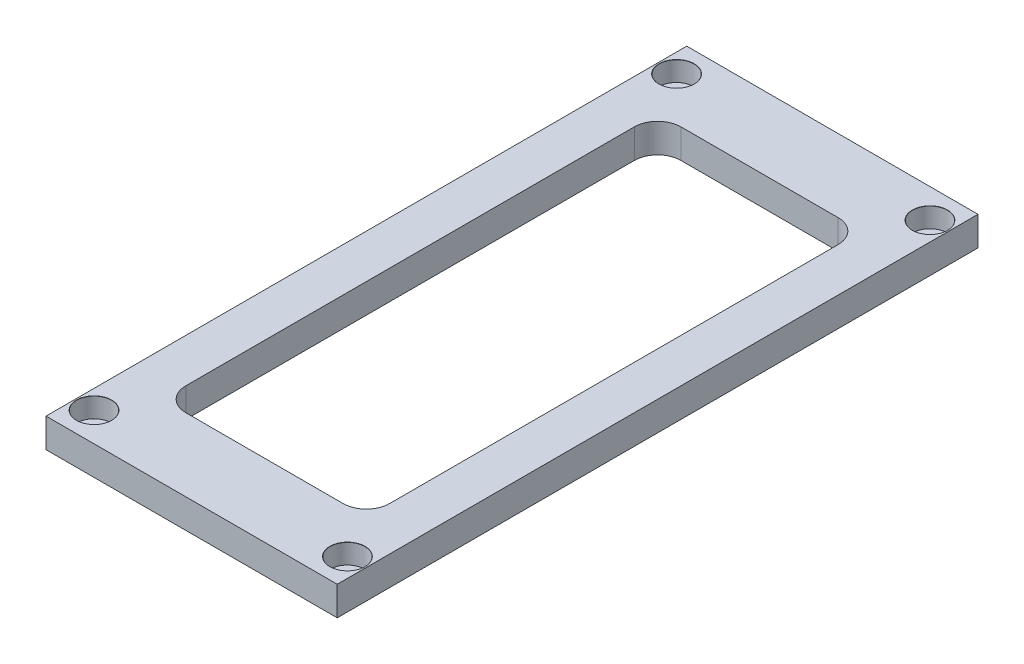
ISO-10303-21;
HEADER;
FILE_DESCRIPTION(('STEP AP214'),'2;1');
FILE_NAME('part.step','',(''),(''),'','','');
FILE_SCHEMA(('AUTOMOTIVE_DESIGN { 1 0 10303 214 1 1 1 1 }'));
ENDSEC;
DATA;
#1=APPLICATION_CONTEXT('core data for automotive mechanical design processes');
#2=APPLICATION_PROTOCOL_DEFINITION('international standard','automotive_design',2000,#1);
#3=PRODUCT_CONTEXT('',#1,'mechanical');
#4=PRODUCT('Part','Part','',(#3));
#5=PRODUCT_RELATED_PRODUCT_CATEGORY('part','',(#4));
#6=PRODUCT_DEFINITION_FORMATION('','',#4);
#7=PRODUCT_DEFINITION_CONTEXT('part definition',#1,'design');
#8=PRODUCT_DEFINITION('design','',#6,#7);
#9=PRODUCT_DEFINITION_SHAPE('','',#8);
#10=(LENGTH_UNIT() NAMED_UNIT(*) SI_UNIT(.MILLI.,.METRE.));
#11=(NAMED_UNIT(*) PLANE_ANGLE_UNIT() SI_UNIT($,.RADIAN.));
#12=(NAMED_UNIT(*) SI_UNIT($,.STERADIAN.) SOLID_ANGLE_UNIT());
#13=UNCERTAINTY_MEASURE_WITH_UNIT(LENGTH_MEASURE(1.E-05),#10,'distance_accuracy_value','');
#14=(GEOMETRIC_REPRESENTATION_CONTEXT(3) GLOBAL_UNCERTAINTY_ASSIGNED_CONTEXT((#13)) GLOBAL_UNIT_ASSIGNED_CONTEXT((#10,
#11,#12)) REPRESENTATION_CONTEXT('',''));
#15=CARTESIAN_POINT('',(0.,0.,0.));
#16=DIRECTION('',(0.,0.,1.));
#17=DIRECTION('',(1.,0.,0.));
#18=AXIS2_PLACEMENT_3D('',#15,#16,#17);
#19=CARTESIAN_POINT('',(-25.,5.,55.));
#20=DIRECTION('',(1.,0.,0.));
#21=DIRECTION('',(0.,0.,-1.));
#22=AXIS2_PLACEMENT_3D('',#19,#20,#21);
#23=PLANE('',#22);
#24=DIRECTION('',(0.,0.,1.));
#25=VECTOR('',#24,1.);
#26=CARTESIAN_POINT('',(-25.,0.,55.));
#27=LINE('',#26,#25);
#28=CARTESIAN_POINT('',(-25.,0.,-55.));
#29=VERTEX_POINT('',#28);
#30=CARTESIAN_POINT('',(-25.,0.,55.));
#31=VERTEX_POINT('',#30);
#32=EDGE_CURVE('E155',#29,#31,#27,.T.);
#33=ORIENTED_EDGE('',*,*,#32,.T.);
#34=DIRECTION('',(0.,-1.,0.));
#35=VECTOR('',#34,1.);
#36=CARTESIAN_POINT('',(-25.,5.,55.));
#37=LINE('',#36,#35);
#38=CARTESIAN_POINT('',(-25.,5.,55.));
#39=VERTEX_POINT('',#38);
#40=EDGE_CURVE('E134',#39,#31,#37,.T.);
#41=ORIENTED_EDGE('',*,*,#40,.F.);
#42=DIRECTION('',(0.,0.,1.));
#43=VECTOR('',#42,1.);
#44=CARTESIAN_POINT('',(-25.,5.,55.));
#45=LINE('',#44,#43);
#46=CARTESIAN_POINT('',(-25.,5.,-55.));
#47=VERTEX_POINT('',#46);
#48=EDGE_CURVE('E142',#47,#39,#45,.T.);
#49=ORIENTED_EDGE('',*,*,#48,.F.);
#50=DIRECTION('',(0.,-1.,0.));
#51=VECTOR('',#50,1.);
#52=CARTESIAN_POINT('',(-25.,5.,-55.));
#53=LINE('',#52,#51);
#54=EDGE_CURVE('E335',#47,#29,#53,.T.);
#55=ORIENTED_EDGE('',*,*,#54,.T.);
#56=EDGE_LOOP('',(#33,#41,#49,#55));
#57=FACE_BOUND('',#56,.T.);
#58=ADVANCED_FACE('F40',(#57),#23,.F.);
#59=CARTESIAN_POINT('',(25.,5.,55.));
#60=DIRECTION('',(0.,0.,-1.));
#61=DIRECTION('',(-1.,0.,0.));
#62=AXIS2_PLACEMENT_3D('',#59,#60,#61);
#63=PLANE('',#62);
#64=DIRECTION('',(1.,0.,0.));
#65=VECTOR('',#64,1.);
#66=CARTESIAN_POINT('',(25.,0.,55.));
#67=LINE('',#66,#65);
#68=CARTESIAN_POINT('',(25.,0.,55.));
#69=VERTEX_POINT('',#68);
#70=EDGE_CURVE('E338',#31,#69,#67,.T.);
#71=ORIENTED_EDGE('',*,*,#70,.T.);
#72=DIRECTION('',(0.,-1.,0.));
#73=VECTOR('',#72,1.);
#74=CARTESIAN_POINT('',(25.,5.,55.));
#75=LINE('',#74,#73);
#76=CARTESIAN_POINT('',(25.,5.,55.));
#77=VERTEX_POINT('',#76);
#78=EDGE_CURVE('E137',#77,#69,#75,.T.);
#79=ORIENTED_EDGE('',*,*,#78,.F.);
#80=DIRECTION('',(1.,0.,0.));
#81=VECTOR('',#80,1.);
#82=CARTESIAN_POINT('',(25.,5.,55.));
#83=LINE('',#82,#81);
#84=EDGE_CURVE('E130',#39,#77,#83,.T.);
#85=ORIENTED_EDGE('',*,*,#84,.F.);
#86=ORIENTED_EDGE('',*,*,#40,.T.);
#87=EDGE_LOOP('',(#71,#79,#85,#86));
#88=FACE_BOUND('',#87,.T.);
#89=ADVANCED_FACE('F132',(#88),#63,.F.);
#90=CARTESIAN_POINT('',(25.,5.,55.));
#91=DIRECTION('',(-1.,0.,0.));
#92=DIRECTION('',(0.,0.,1.));
#93=AXIS2_PLACEMENT_3D('',#90,#91,#92);
#94=PLANE('',#93);
#95=DIRECTION('',(0.,0.,-1.));
#96=VECTOR('',#95,1.);
#97=CARTESIAN_POINT('',(25.,0.,55.));
#98=LINE('',#97,#96);
#99=CARTESIAN_POINT('',(25.,0.,-55.));
#100=VERTEX_POINT('',#99);
#101=EDGE_CURVE('E341',#69,#100,#98,.T.);
#102=ORIENTED_EDGE('',*,*,#101,.T.);
#103=DIRECTION('',(0.,-1.,0.));
#104=VECTOR('',#103,1.);
#105=CARTESIAN_POINT('',(25.,5.,-55.));
#106=LINE('',#105,#104);
#107=CARTESIAN_POINT('',(25.,5.,-55.));
#108=VERTEX_POINT('',#107);
#109=EDGE_CURVE('E163',#108,#100,#106,.T.);
#110=ORIENTED_EDGE('',*,*,#109,.F.);
#111=DIRECTION('',(0.,0.,-1.));
#112=VECTOR('',#111,1.);
#113=CARTESIAN_POINT('',(25.,5.,55.));
#114=LINE('',#113,#112);
#115=EDGE_CURVE('E141',#77,#108,#114,.T.);
#116=ORIENTED_EDGE('',*,*,#115,.F.);
#117=ORIENTED_EDGE('',*,*,#78,.T.);
#118=EDGE_LOOP('',(#102,#110,#116,#117));
#119=FACE_BOUND('',#118,.T.);
#120=ADVANCED_FACE('F357',(#119),#94,.F.);
#121=CARTESIAN_POINT('',(25.,5.,-55.));
#122=DIRECTION('',(0.,0.,1.));
#123=DIRECTION('',(1.,0.,0.));
#124=AXIS2_PLACEMENT_3D('',#121,#122,#123);
#125=PLANE('',#124);
#126=DIRECTION('',(-1.,0.,0.));
#127=VECTOR('',#126,1.);
#128=CARTESIAN_POINT('',(25.,0.,-55.));
#129=LINE('',#128,#127);
#130=EDGE_CURVE('E152',#100,#29,#129,.T.);
#131=ORIENTED_EDGE('',*,*,#130,.T.);
#132=ORIENTED_EDGE('',*,*,#54,.F.);
#133=DIRECTION('',(-1.,0.,0.));
#134=VECTOR('',#133,1.);
#135=CARTESIAN_POINT('',(25.,5.,-55.));
#136=LINE('',#135,#134);
#137=EDGE_CURVE('E147',#108,#47,#136,.T.);
#138=ORIENTED_EDGE('',*,*,#137,.F.);
#139=ORIENTED_EDGE('',*,*,#109,.T.);
#140=EDGE_LOOP('',(#131,#132,#138,#139));
#141=FACE_BOUND('',#140,.T.);
#142=ADVANCED_FACE('F352',(#141),#125,.F.);
#143=CARTESIAN_POINT('',(0.,5.,0.));
#144=DIRECTION('',(0.,1.,0.));
#145=DIRECTION('',(0.,0.,1.));
#146=AXIS2_PLACEMENT_3D('',#143,#144,#145);
#147=PLANE('',#146);
#148=DIRECTION('',(0.,0.,1.));
#149=VECTOR('',#148,1.);
#150=CARTESIAN_POINT('',(-17.5,5.,42.5));
#151=LINE('',#150,#149);
#152=CARTESIAN_POINT('',(-17.5,5.,-38.5));
#153=VERTEX_POINT('',#152);
#154=CARTESIAN_POINT('',(-17.5,5.,38.5));
#155=VERTEX_POINT('',#154);
#156=EDGE_CURVE('E237',#153,#155,#151,.T.);
#157=ORIENTED_EDGE('',*,*,#156,.F.);
#158=CARTESIAN_POINT('',(-13.5,5.,-38.5));
#159=DIRECTION('',(0.,1.,0.));
#160=DIRECTION('',(0.,0.,1.));
#161=AXIS2_PLACEMENT_3D('',#158,#159,#160);
#162=CIRCLE('',#161,4.);
#163=CARTESIAN_POINT('',(-13.5,5.,-42.5));
#164=VERTEX_POINT('',#163);
#165=EDGE_CURVE('E49',#153,#164,#162,.F.);
#166=ORIENTED_EDGE('',*,*,#165,.T.);
#167=DIRECTION('',(-1.,0.,0.));
#168=VECTOR('',#167,1.);
#169=CARTESIAN_POINT('',(17.5,5.,-42.5));
#170=LINE('',#169,#168);
#171=CARTESIAN_POINT('',(13.5,5.,-42.5));
#172=VERTEX_POINT('',#171);
#173=EDGE_CURVE('E236',#172,#164,#170,.T.);
#174=ORIENTED_EDGE('',*,*,#173,.F.);
#175=CARTESIAN_POINT('',(13.5,5.,-38.5));
#176=DIRECTION('',(0.,1.,0.));
#177=DIRECTION('',(0.,0.,1.));
#178=AXIS2_PLACEMENT_3D('',#175,#176,#177);
#179=CIRCLE('',#178,4.);
#180=CARTESIAN_POINT('',(17.5,5.,-38.5));
#181=VERTEX_POINT('',#180);
#182=EDGE_CURVE('E213',#172,#181,#179,.F.);
#183=ORIENTED_EDGE('',*,*,#182,.T.);
#184=DIRECTION('',(0.,0.,-1.));
#185=VECTOR('',#184,1.);
#186=CARTESIAN_POINT('',(17.5,5.,42.5));
#187=LINE('',#186,#185);
#188=CARTESIAN_POINT('',(17.5,5.,38.5));
#189=VERTEX_POINT('',#188);
#190=EDGE_CURVE('E247',#189,#181,#187,.T.);
#191=ORIENTED_EDGE('',*,*,#190,.F.);
#192=CARTESIAN_POINT('',(13.5,5.,38.5));
#193=DIRECTION('',(0.,1.,0.));
#194=DIRECTION('',(0.,0.,1.));
#195=AXIS2_PLACEMENT_3D('',#192,#193,#194);
#196=CIRCLE('',#195,4.);
#197=CARTESIAN_POINT('',(13.5,5.,42.5));
#198=VERTEX_POINT('',#197);
#199=EDGE_CURVE('E219',#189,#198,#196,.F.);
#200=ORIENTED_EDGE('',*,*,#199,.T.);
#201=DIRECTION('',(1.,0.,0.));
#202=VECTOR('',#201,1.);
#203=CARTESIAN_POINT('',(17.5,5.,42.5));
#204=LINE('',#203,#202);
#205=CARTESIAN_POINT('',(-13.5,5.,42.5));
#206=VERTEX_POINT('',#205);
#207=EDGE_CURVE('E268',#206,#198,#204,.T.);
#208=ORIENTED_EDGE('',*,*,#207,.F.);
#209=CARTESIAN_POINT('',(-13.5,5.,38.5));
#210=DIRECTION('',(0.,1.,0.));
#211=DIRECTION('',(0.,0.,1.));
#212=AXIS2_PLACEMENT_3D('',#209,#210,#211);
#213=CIRCLE('',#212,4.);
#214=EDGE_CURVE('E225',#206,#155,#213,.F.);
#215=ORIENTED_EDGE('',*,*,#214,.T.);
#216=EDGE_LOOP('',(#157,#166,#174,#183,#191,#200,#208,#215));
#217=FACE_BOUND('',#216,.T.);
#218=CARTESIAN_POINT('',(-21.75,5.,-50.));
#219=DIRECTION('',(0.,1.,0.));
#220=DIRECTION('',(0.,0.,1.));
#221=AXIS2_PLACEMENT_3D('',#218,#219,#220);
#222=CIRCLE('',#221,3.025);
#223=CARTESIAN_POINT('',(-21.75,5.,-46.975));
#224=VERTEX_POINT('',#223);
#225=EDGE_CURVE('E265',#224,#224,#222,.T.);
#226=ORIENTED_EDGE('',*,*,#225,.F.);
#227=EDGE_LOOP('',(#226));
#228=FACE_BOUND('',#227,.T.);
#229=CARTESIAN_POINT('',(21.75,5.,-50.));
#230=DIRECTION('',(0.,1.,0.));
#231=DIRECTION('',(0.,0.,1.));
#232=AXIS2_PLACEMENT_3D('',#229,#230,#231);
#233=CIRCLE('',#232,3.025);
#234=CARTESIAN_POINT('',(21.75,5.,-46.975));
#235=VERTEX_POINT('',#234);
#236=EDGE_CURVE('E187',#235,#235,#233,.T.);
#237=ORIENTED_EDGE('',*,*,#236,.F.);
#238=EDGE_LOOP('',(#237));
#239=FACE_BOUND('',#238,.T.);
#240=CARTESIAN_POINT('',(-21.75,5.,50.));
#241=DIRECTION('',(0.,1.,0.));
#242=DIRECTION('',(0.,0.,1.));
#243=AXIS2_PLACEMENT_3D('',#240,#241,#242);
#244=CIRCLE('',#243,3.025);
#245=CARTESIAN_POINT('',(-21.75,5.,53.025));
#246=VERTEX_POINT('',#245);
#247=EDGE_CURVE('E182',#246,#246,#244,.T.);
#248=ORIENTED_EDGE('',*,*,#247,.F.);
#249=EDGE_LOOP('',(#248));
#250=FACE_BOUND('',#249,.T.);
#251=CARTESIAN_POINT('',(21.75,5.,50.));
#252=DIRECTION('',(0.,1.,0.));
#253=DIRECTION('',(0.,0.,1.));
#254=AXIS2_PLACEMENT_3D('',#251,#252,#253);
#255=CIRCLE('',#254,3.025);
#256=CARTESIAN_POINT('',(21.75,5.,53.025));
#257=VERTEX_POINT('',#256);
#258=EDGE_CURVE('E176',#257,#257,#255,.T.);
#259=ORIENTED_EDGE('',*,*,#258,.F.);
#260=EDGE_LOOP('',(#259));
#261=FACE_BOUND('',#260,.T.);
#262=ORIENTED_EDGE('',*,*,#48,.T.);
#263=ORIENTED_EDGE('',*,*,#84,.T.);
#264=ORIENTED_EDGE('',*,*,#115,.T.);
#265=ORIENTED_EDGE('',*,*,#137,.T.);
#266=EDGE_LOOP('',(#262,#263,#264,#265));
#267=FACE_BOUND('',#266,.T.);
#268=ADVANCED_FACE('F145',(#217,#228,#239,#250,#261,#267),#147,.T.);
#269=CARTESIAN_POINT('',(0.,0.,0.));
#270=DIRECTION('',(0.,1.,0.));
#271=DIRECTION('',(0.,0.,1.));
#272=AXIS2_PLACEMENT_3D('',#269,#270,#271);
#273=PLANE('',#272);
#274=DIRECTION('',(0.,0.,-1.));
#275=VECTOR('',#274,1.);
#276=CARTESIAN_POINT('',(17.5,0.,42.5));
#277=LINE('',#276,#275);
#278=CARTESIAN_POINT('',(17.5,0.,38.5));
#279=VERTEX_POINT('',#278);
#280=CARTESIAN_POINT('',(17.5,0.,-38.5));
#281=VERTEX_POINT('',#280);
#282=EDGE_CURVE('E256',#279,#281,#277,.T.);
#283=ORIENTED_EDGE('',*,*,#282,.T.);
#284=CARTESIAN_POINT('',(13.5,0.,-38.5));
#285=DIRECTION('',(0.,1.,0.));
#286=DIRECTION('',(0.,0.,1.));
#287=AXIS2_PLACEMENT_3D('',#284,#285,#286);
#288=CIRCLE('',#287,4.);
#289=CARTESIAN_POINT('',(13.5,0.,-42.5));
#290=VERTEX_POINT('',#289);
#291=EDGE_CURVE('E216',#281,#290,#288,.T.);
#292=ORIENTED_EDGE('',*,*,#291,.T.);
#293=DIRECTION('',(-1.,0.,0.));
#294=VECTOR('',#293,1.);
#295=CARTESIAN_POINT('',(17.5,0.,-42.5));
#296=LINE('',#295,#294);
#297=CARTESIAN_POINT('',(-13.5,0.,-42.5));
#298=VERTEX_POINT('',#297);
#299=EDGE_CURVE('E262',#290,#298,#296,.T.);
#300=ORIENTED_EDGE('',*,*,#299,.T.);
#301=CARTESIAN_POINT('',(-13.5,0.,-38.5));
#302=DIRECTION('',(0.,1.,0.));
#303=DIRECTION('',(0.,0.,1.));
#304=AXIS2_PLACEMENT_3D('',#301,#302,#303);
#305=CIRCLE('',#304,4.);
#306=CARTESIAN_POINT('',(-17.5,0.,-38.5));
#307=VERTEX_POINT('',#306);
#308=EDGE_CURVE('E11',#298,#307,#305,.T.);
#309=ORIENTED_EDGE('',*,*,#308,.T.);
#310=DIRECTION('',(0.,0.,1.));
#311=VECTOR('',#310,1.);
#312=CARTESIAN_POINT('',(-17.5,0.,42.5));
#313=LINE('',#312,#311);
#314=CARTESIAN_POINT('',(-17.5,0.,38.5));
#315=VERTEX_POINT('',#314);
#316=EDGE_CURVE('E246',#307,#315,#313,.T.);
#317=ORIENTED_EDGE('',*,*,#316,.T.);
#318=CARTESIAN_POINT('',(-13.5,0.,38.5));
#319=DIRECTION('',(0.,1.,0.));
#320=DIRECTION('',(0.,0.,1.));
#321=AXIS2_PLACEMENT_3D('',#318,#319,#320);
#322=CIRCLE('',#321,4.);
#323=CARTESIAN_POINT('',(-13.5,0.,42.5));
#324=VERTEX_POINT('',#323);
#325=EDGE_CURVE('E228',#315,#324,#322,.T.);
#326=ORIENTED_EDGE('',*,*,#325,.T.);
#327=DIRECTION('',(1.,0.,0.));
#328=VECTOR('',#327,1.);
#329=CARTESIAN_POINT('',(17.5,0.,42.5));
#330=LINE('',#329,#328);
#331=CARTESIAN_POINT('',(13.5,0.,42.5));
#332=VERTEX_POINT('',#331);
#333=EDGE_CURVE('E252',#324,#332,#330,.T.);
#334=ORIENTED_EDGE('',*,*,#333,.T.);
#335=CARTESIAN_POINT('',(13.5,0.,38.5));
#336=DIRECTION('',(0.,1.,0.));
#337=DIRECTION('',(0.,0.,1.));
#338=AXIS2_PLACEMENT_3D('',#335,#336,#337);
#339=CIRCLE('',#338,4.);
#340=EDGE_CURVE('E222',#332,#279,#339,.T.);
#341=ORIENTED_EDGE('',*,*,#340,.T.);
#342=EDGE_LOOP('',(#283,#292,#300,#309,#317,#326,#334,#341));
#343=FACE_BOUND('',#342,.T.);
#344=CARTESIAN_POINT('',(-21.75,0.,-50.));
#345=DIRECTION('',(0.,1.,0.));
#346=DIRECTION('',(0.,0.,1.));
#347=AXIS2_PLACEMENT_3D('',#344,#345,#346);
#348=CIRCLE('',#347,1.6);
#349=CARTESIAN_POINT('',(-21.75,0.,-48.4));
#350=VERTEX_POINT('',#349);
#351=EDGE_CURVE('E184',#350,#350,#348,.T.);
#352=ORIENTED_EDGE('',*,*,#351,.T.);
#353=EDGE_LOOP('',(#352));
#354=FACE_BOUND('',#353,.T.);
#355=CARTESIAN_POINT('',(21.75,0.,-50.));
#356=DIRECTION('',(0.,1.,0.));
#357=DIRECTION('',(0.,0.,1.));
#358=AXIS2_PLACEMENT_3D('',#355,#356,#357);
#359=CIRCLE('',#358,1.6);
#360=CARTESIAN_POINT('',(21.75,0.,-48.4));
#361=VERTEX_POINT('',#360);
#362=EDGE_CURVE('E178',#361,#361,#359,.T.);
#363=ORIENTED_EDGE('',*,*,#362,.T.);
#364=EDGE_LOOP('',(#363));
#365=FACE_BOUND('',#364,.T.);
#366=CARTESIAN_POINT('',(-21.75,0.,50.));
#367=DIRECTION('',(0.,1.,0.));
#368=DIRECTION('',(0.,0.,1.));
#369=AXIS2_PLACEMENT_3D('',#366,#367,#368);
#370=CIRCLE('',#369,1.6);
#371=CARTESIAN_POINT('',(-21.75,0.,51.6));
#372=VERTEX_POINT('',#371);
#373=EDGE_CURVE('E172',#372,#372,#370,.T.);
#374=ORIENTED_EDGE('',*,*,#373,.T.);
#375=EDGE_LOOP('',(#374));
#376=FACE_BOUND('',#375,.T.);
#377=CARTESIAN_POINT('',(21.75,0.,50.));
#378=DIRECTION('',(0.,1.,0.));
#379=DIRECTION('',(0.,0.,1.));
#380=AXIS2_PLACEMENT_3D('',#377,#378,#379);
#381=CIRCLE('',#380,1.6);
#382=CARTESIAN_POINT('',(21.75,0.,51.6));
#383=VERTEX_POINT('',#382);
#384=EDGE_CURVE('E167',#383,#383,#381,.T.);
#385=ORIENTED_EDGE('',*,*,#384,.T.);
#386=EDGE_LOOP('',(#385));
#387=FACE_BOUND('',#386,.T.);
#388=ORIENTED_EDGE('',*,*,#32,.F.);
#389=ORIENTED_EDGE('',*,*,#130,.F.);
#390=ORIENTED_EDGE('',*,*,#101,.F.);
#391=ORIENTED_EDGE('',*,*,#70,.F.);
#392=EDGE_LOOP('',(#388,#389,#390,#391));
#393=FACE_BOUND('',#392,.T.);
#394=ADVANCED_FACE('F356',(#343,#354,#365,#376,#387,#393),#273,.F.);
#395=CARTESIAN_POINT('',(21.75,5.,50.));
#396=DIRECTION('',(0.,1.,0.));
#397=DIRECTION('',(0.,0.,1.));
#398=AXIS2_PLACEMENT_3D('',#395,#396,#397);
#399=CYLINDRICAL_SURFACE('',#398,1.6);
#400=CARTESIAN_POINT('',(21.75,1.6,50.));
#401=DIRECTION('',(0.,1.,0.));
#402=DIRECTION('',(0.,0.,1.));
#403=AXIS2_PLACEMENT_3D('',#400,#401,#402);
#404=CIRCLE('',#403,1.6);
#405=CARTESIAN_POINT('',(21.75,1.6,51.6));
#406=VERTEX_POINT('',#405);
#407=EDGE_CURVE('E171',#406,#406,#404,.T.);
#408=ORIENTED_EDGE('',*,*,#407,.T.);
#409=EDGE_LOOP('',(#408));
#410=FACE_BOUND('',#409,.T.);
#411=ORIENTED_EDGE('',*,*,#384,.F.);
#412=EDGE_LOOP('',(#411));
#413=FACE_BOUND('',#412,.T.);
#414=ADVANCED_FACE('F469',(#410,#413),#399,.F.);
#415=CARTESIAN_POINT('',(23.35,1.6,50.));
#416=DIRECTION('',(0.,-1.,0.));
#417=DIRECTION('',(0.,0.,-1.));
#418=AXIS2_PLACEMENT_3D('',#415,#416,#417);
#419=PLANE('',#418);
#420=ORIENTED_EDGE('',*,*,#407,.F.);
#421=EDGE_LOOP('',(#420));
#422=FACE_BOUND('',#421,.T.);
#423=CARTESIAN_POINT('',(21.75,1.6,50.));
#424=DIRECTION('',(0.,1.,0.));
#425=DIRECTION('',(0.,0.,1.));
#426=AXIS2_PLACEMENT_3D('',#423,#424,#425);
#427=CIRCLE('',#426,3.);
#428=CARTESIAN_POINT('',(21.75,1.6,53.));
#429=VERTEX_POINT('',#428);
#430=EDGE_CURVE('E324',#429,#429,#427,.T.);
#431=ORIENTED_EDGE('',*,*,#430,.T.);
#432=EDGE_LOOP('',(#431));
#433=FACE_BOUND('',#432,.T.);
#434=ADVANCED_FACE('F465',(#422,#433),#419,.F.);
#435=CARTESIAN_POINT('',(21.75,5.,50.));
#436=DIRECTION('',(0.,1.,0.));
#437=DIRECTION('',(0.,0.,1.));
#438=AXIS2_PLACEMENT_3D('',#435,#436,#437);
#439=CYLINDRICAL_SURFACE('',#438,3.);
#440=ORIENTED_EDGE('',*,*,#430,.F.);
#441=EDGE_LOOP('',(#440));
#442=FACE_BOUND('',#441,.T.);
#443=CARTESIAN_POINT('',(21.75,4.975,50.));
#444=DIRECTION('',(0.,1.,0.));
#445=DIRECTION('',(0.,0.,1.));
#446=AXIS2_PLACEMENT_3D('',#443,#444,#445);
#447=CIRCLE('',#446,3.);
#448=CARTESIAN_POINT('',(21.75,4.975,53.));
#449=VERTEX_POINT('',#448);
#450=EDGE_CURVE('E320',#449,#449,#447,.T.);
#451=ORIENTED_EDGE('',*,*,#450,.T.);
#452=EDGE_LOOP('',(#451));
#453=FACE_BOUND('',#452,.T.);
#454=ADVANCED_FACE('F461',(#442,#453),#439,.F.);
#455=CARTESIAN_POINT('',(21.75,5.,50.));
#456=DIRECTION('',(0.,1.,0.));
#457=DIRECTION('',(0.,0.,1.));
#458=AXIS2_PLACEMENT_3D('',#455,#456,#457);
#459=CONICAL_SURFACE('',#458,3.025,0.785398163397448);
#460=ORIENTED_EDGE('',*,*,#450,.F.);
#461=EDGE_LOOP('',(#460));
#462=FACE_BOUND('',#461,.T.);
#463=ORIENTED_EDGE('',*,*,#258,.T.);
#464=EDGE_LOOP('',(#463));
#465=FACE_BOUND('',#464,.T.);
#466=ADVANCED_FACE('F457',(#462,#465),#459,.F.);
#467=CARTESIAN_POINT('',(-21.75,5.,50.));
#468=DIRECTION('',(0.,1.,0.));
#469=DIRECTION('',(0.,0.,1.));
#470=AXIS2_PLACEMENT_3D('',#467,#468,#469);
#471=CYLINDRICAL_SURFACE('',#470,1.6);
#472=CARTESIAN_POINT('',(-21.75,1.6,50.));
#473=DIRECTION('',(0.,1.,0.));
#474=DIRECTION('',(0.,0.,1.));
#475=AXIS2_PLACEMENT_3D('',#472,#473,#474);
#476=CIRCLE('',#475,1.6);
#477=CARTESIAN_POINT('',(-21.75,1.6,51.6));
#478=VERTEX_POINT('',#477);
#479=EDGE_CURVE('E177',#478,#478,#476,.T.);
#480=ORIENTED_EDGE('',*,*,#479,.T.);
#481=EDGE_LOOP('',(#480));
#482=FACE_BOUND('',#481,.T.);
#483=ORIENTED_EDGE('',*,*,#373,.F.);
#484=EDGE_LOOP('',(#483));
#485=FACE_BOUND('',#484,.T.);
#486=ADVANCED_FACE('F453',(#482,#485),#471,.F.);
#487=CARTESIAN_POINT('',(-20.15,1.6,50.));
#488=DIRECTION('',(0.,-1.,0.));
#489=DIRECTION('',(0.,0.,-1.));
#490=AXIS2_PLACEMENT_3D('',#487,#488,#489);
#491=PLANE('',#490);
#492=ORIENTED_EDGE('',*,*,#479,.F.);
#493=EDGE_LOOP('',(#492));
#494=FACE_BOUND('',#493,.T.);
#495=CARTESIAN_POINT('',(-21.75,1.6,50.));
#496=DIRECTION('',(0.,1.,0.));
#497=DIRECTION('',(0.,0.,1.));
#498=AXIS2_PLACEMENT_3D('',#495,#496,#497);
#499=CIRCLE('',#498,3.);
#500=CARTESIAN_POINT('',(-21.75,1.6,53.));
#501=VERTEX_POINT('',#500);
#502=EDGE_CURVE('E310',#501,#501,#499,.T.);
#503=ORIENTED_EDGE('',*,*,#502,.T.);
#504=EDGE_LOOP('',(#503));
#505=FACE_BOUND('',#504,.T.);
#506=ADVANCED_FACE('F449',(#494,#505),#491,.F.);
#507=CARTESIAN_POINT('',(-21.75,5.,50.));
#508=DIRECTION('',(0.,1.,0.));
#509=DIRECTION('',(0.,0.,1.));
#510=AXIS2_PLACEMENT_3D('',#507,#508,#509);
#511=CYLINDRICAL_SURFACE('',#510,3.);
#512=ORIENTED_EDGE('',*,*,#502,.F.);
#513=EDGE_LOOP('',(#512));
#514=FACE_BOUND('',#513,.T.);
#515=CARTESIAN_POINT('',(-21.75,4.975,50.));
#516=DIRECTION('',(0.,1.,0.));
#517=DIRECTION('',(0.,0.,1.));
#518=AXIS2_PLACEMENT_3D('',#515,#516,#517);
#519=CIRCLE('',#518,3.);
#520=CARTESIAN_POINT('',(-21.75,4.975,53.));
#521=VERTEX_POINT('',#520);
#522=EDGE_CURVE('E306',#521,#521,#519,.T.);
#523=ORIENTED_EDGE('',*,*,#522,.T.);
#524=EDGE_LOOP('',(#523));
#525=FACE_BOUND('',#524,.T.);
#526=ADVANCED_FACE('F445',(#514,#525),#511,.F.);
#527=CARTESIAN_POINT('',(-21.75,5.,50.));
#528=DIRECTION('',(0.,1.,0.));
#529=DIRECTION('',(0.,0.,1.));
#530=AXIS2_PLACEMENT_3D('',#527,#528,#529);
#531=CONICAL_SURFACE('',#530,3.025,0.785398163397448);
#532=ORIENTED_EDGE('',*,*,#522,.F.);
#533=EDGE_LOOP('',(#532));
#534=FACE_BOUND('',#533,.T.);
#535=ORIENTED_EDGE('',*,*,#247,.T.);
#536=EDGE_LOOP('',(#535));
#537=FACE_BOUND('',#536,.T.);
#538=ADVANCED_FACE('F441',(#534,#537),#531,.F.);
#539=CARTESIAN_POINT('',(21.75,5.,-50.));
#540=DIRECTION('',(0.,1.,0.));
#541=DIRECTION('',(0.,0.,1.));
#542=AXIS2_PLACEMENT_3D('',#539,#540,#541);
#543=CYLINDRICAL_SURFACE('',#542,1.6);
#544=CARTESIAN_POINT('',(21.75,1.6,-50.));
#545=DIRECTION('',(0.,1.,0.));
#546=DIRECTION('',(0.,0.,1.));
#547=AXIS2_PLACEMENT_3D('',#544,#545,#546);
#548=CIRCLE('',#547,1.6);
#549=CARTESIAN_POINT('',(21.75,1.6,-48.4));
#550=VERTEX_POINT('',#549);
#551=EDGE_CURVE('E183',#550,#550,#548,.T.);
#552=ORIENTED_EDGE('',*,*,#551,.T.);
#553=EDGE_LOOP('',(#552));
#554=FACE_BOUND('',#553,.T.);
#555=ORIENTED_EDGE('',*,*,#362,.F.);
#556=EDGE_LOOP('',(#555));
#557=FACE_BOUND('',#556,.T.);
#558=ADVANCED_FACE('F437',(#554,#557),#543,.F.);
#559=CARTESIAN_POINT('',(23.35,1.6,-50.));
#560=DIRECTION('',(0.,-1.,0.));
#561=DIRECTION('',(0.,0.,-1.));
#562=AXIS2_PLACEMENT_3D('',#559,#560,#561);
#563=PLANE('',#562);
#564=ORIENTED_EDGE('',*,*,#551,.F.);
#565=EDGE_LOOP('',(#564));
#566=FACE_BOUND('',#565,.T.);
#567=CARTESIAN_POINT('',(21.75,1.6,-50.));
#568=DIRECTION('',(0.,1.,0.));
#569=DIRECTION('',(0.,0.,1.));
#570=AXIS2_PLACEMENT_3D('',#567,#568,#569);
#571=CIRCLE('',#570,3.);
#572=CARTESIAN_POINT('',(21.75,1.6,-47.));
#573=VERTEX_POINT('',#572);
#574=EDGE_CURVE('E296',#573,#573,#571,.T.);
#575=ORIENTED_EDGE('',*,*,#574,.T.);
#576=EDGE_LOOP('',(#575));
#577=FACE_BOUND('',#576,.T.);
#578=ADVANCED_FACE('F433',(#566,#577),#563,.F.);
#579=CARTESIAN_POINT('',(21.75,5.,-50.));
#580=DIRECTION('',(0.,1.,0.));
#581=DIRECTION('',(0.,0.,1.));
#582=AXIS2_PLACEMENT_3D('',#579,#580,#581);
#583=CYLINDRICAL_SURFACE('',#582,3.);
#584=ORIENTED_EDGE('',*,*,#574,.F.);
#585=EDGE_LOOP('',(#584));
#586=FACE_BOUND('',#585,.T.);
#587=CARTESIAN_POINT('',(21.75,4.975,-50.));
#588=DIRECTION('',(0.,1.,0.));
#589=DIRECTION('',(0.,0.,1.));
#590=AXIS2_PLACEMENT_3D('',#587,#588,#589);
#591=CIRCLE('',#590,3.);
#592=CARTESIAN_POINT('',(21.75,4.975,-47.));
#593=VERTEX_POINT('',#592);
#594=EDGE_CURVE('E292',#593,#593,#591,.T.);
#595=ORIENTED_EDGE('',*,*,#594,.T.);
#596=EDGE_LOOP('',(#595));
#597=FACE_BOUND('',#596,.T.);
#598=ADVANCED_FACE('F429',(#586,#597),#583,.F.);
#599=CARTESIAN_POINT('',(21.75,5.,-50.));
#600=DIRECTION('',(0.,1.,0.));
#601=DIRECTION('',(0.,0.,1.));
#602=AXIS2_PLACEMENT_3D('',#599,#600,#601);
#603=CONICAL_SURFACE('',#602,3.025,0.785398163397448);
#604=ORIENTED_EDGE('',*,*,#594,.F.);
#605=EDGE_LOOP('',(#604));
#606=FACE_BOUND('',#605,.T.);
#607=ORIENTED_EDGE('',*,*,#236,.T.);
#608=EDGE_LOOP('',(#607));
#609=FACE_BOUND('',#608,.T.);
#610=ADVANCED_FACE('F425',(#606,#609),#603,.F.);
#611=CARTESIAN_POINT('',(-21.75,5.,-50.));
#612=DIRECTION('',(0.,1.,0.));
#613=DIRECTION('',(0.,0.,1.));
#614=AXIS2_PLACEMENT_3D('',#611,#612,#613);
#615=CYLINDRICAL_SURFACE('',#614,1.6);
#616=CARTESIAN_POINT('',(-21.75,1.6,-50.));
#617=DIRECTION('',(0.,1.,0.));
#618=DIRECTION('',(0.,0.,1.));
#619=AXIS2_PLACEMENT_3D('',#616,#617,#618);
#620=CIRCLE('',#619,1.6);
#621=CARTESIAN_POINT('',(-21.75,1.6,-48.4));
#622=VERTEX_POINT('',#621);
#623=EDGE_CURVE('E188',#622,#622,#620,.T.);
#624=ORIENTED_EDGE('',*,*,#623,.T.);
#625=EDGE_LOOP('',(#624));
#626=FACE_BOUND('',#625,.T.);
#627=ORIENTED_EDGE('',*,*,#351,.F.);
#628=EDGE_LOOP('',(#627));
#629=FACE_BOUND('',#628,.T.);
#630=ADVANCED_FACE('F421',(#626,#629),#615,.F.);
#631=CARTESIAN_POINT('',(-20.15,1.6,-50.));
#632=DIRECTION('',(0.,-1.,0.));
#633=DIRECTION('',(0.,0.,-1.));
#634=AXIS2_PLACEMENT_3D('',#631,#632,#633);
#635=PLANE('',#634);
#636=ORIENTED_EDGE('',*,*,#623,.F.);
#637=EDGE_LOOP('',(#636));
#638=FACE_BOUND('',#637,.T.);
#639=CARTESIAN_POINT('',(-21.75,1.6,-50.));
#640=DIRECTION('',(0.,1.,0.));
#641=DIRECTION('',(0.,0.,1.));
#642=AXIS2_PLACEMENT_3D('',#639,#640,#641);
#643=CIRCLE('',#642,3.);
#644=CARTESIAN_POINT('',(-21.75,1.6,-47.));
#645=VERTEX_POINT('',#644);
#646=EDGE_CURVE('E282',#645,#645,#643,.T.);
#647=ORIENTED_EDGE('',*,*,#646,.T.);
#648=EDGE_LOOP('',(#647));
#649=FACE_BOUND('',#648,.T.);
#650=ADVANCED_FACE('F417',(#638,#649),#635,.F.);
#651=CARTESIAN_POINT('',(-21.75,5.,-50.));
#652=DIRECTION('',(0.,1.,0.));
#653=DIRECTION('',(0.,0.,1.));
#654=AXIS2_PLACEMENT_3D('',#651,#652,#653);
#655=CYLINDRICAL_SURFACE('',#654,3.);
#656=ORIENTED_EDGE('',*,*,#646,.F.);
#657=EDGE_LOOP('',(#656));
#658=FACE_BOUND('',#657,.T.);
#659=CARTESIAN_POINT('',(-21.75,4.975,-50.));
#660=DIRECTION('',(0.,1.,0.));
#661=DIRECTION('',(0.,0.,1.));
#662=AXIS2_PLACEMENT_3D('',#659,#660,#661);
#663=CIRCLE('',#662,3.);
#664=CARTESIAN_POINT('',(-21.75,4.975,-47.));
#665=VERTEX_POINT('',#664);
#666=EDGE_CURVE('E278',#665,#665,#663,.T.);
#667=ORIENTED_EDGE('',*,*,#666,.T.);
#668=EDGE_LOOP('',(#667));
#669=FACE_BOUND('',#668,.T.);
#670=ADVANCED_FACE('F413',(#658,#669),#655,.F.);
#671=CARTESIAN_POINT('',(-21.75,5.,-50.));
#672=DIRECTION('',(0.,1.,0.));
#673=DIRECTION('',(0.,0.,1.));
#674=AXIS2_PLACEMENT_3D('',#671,#672,#673);
#675=CONICAL_SURFACE('',#674,3.025,0.785398163397448);
#676=ORIENTED_EDGE('',*,*,#666,.F.);
#677=EDGE_LOOP('',(#676));
#678=FACE_BOUND('',#677,.T.);
#679=ORIENTED_EDGE('',*,*,#225,.T.);
#680=EDGE_LOOP('',(#679));
#681=FACE_BOUND('',#680,.T.);
#682=ADVANCED_FACE('F410',(#678,#681),#675,.F.);
#683=CARTESIAN_POINT('',(-17.5,0.,42.5));
#684=DIRECTION('',(-1.,0.,0.));
#685=DIRECTION('',(0.,0.,1.));
#686=AXIS2_PLACEMENT_3D('',#683,#684,#685);
#687=PLANE('',#686);
#688=ORIENTED_EDGE('',*,*,#156,.T.);
#689=DIRECTION('',(0.,1.,0.));
#690=VECTOR('',#689,1.);
#691=CARTESIAN_POINT('',(-17.5,0.,38.5));
#692=LINE('',#691,#690);
#693=EDGE_CURVE('E56',#155,#315,#692,.F.);
#694=ORIENTED_EDGE('',*,*,#693,.T.);
#695=ORIENTED_EDGE('',*,*,#316,.F.);
#696=DIRECTION('',(0.,1.,0.));
#697=VECTOR('',#696,1.);
#698=CARTESIAN_POINT('',(-17.5,5.,-38.5));
#699=LINE('',#698,#697);
#700=EDGE_CURVE('E207',#307,#153,#699,.T.);
#701=ORIENTED_EDGE('',*,*,#700,.T.);
#702=EDGE_LOOP('',(#688,#694,#695,#701));
#703=FACE_BOUND('',#702,.T.);
#704=ADVANCED_FACE('F249',(#703),#687,.F.);
#705=CARTESIAN_POINT('',(17.5,0.,-42.5));
#706=DIRECTION('',(0.,0.,-1.));
#707=DIRECTION('',(-1.,0.,0.));
#708=AXIS2_PLACEMENT_3D('',#705,#706,#707);
#709=PLANE('',#708);
#710=ORIENTED_EDGE('',*,*,#299,.F.);
#711=DIRECTION('',(0.,1.,0.));
#712=VECTOR('',#711,1.);
#713=CARTESIAN_POINT('',(13.5,5.,-42.5));
#714=LINE('',#713,#712);
#715=EDGE_CURVE('E161',#290,#172,#714,.T.);
#716=ORIENTED_EDGE('',*,*,#715,.T.);
#717=ORIENTED_EDGE('',*,*,#173,.T.);
#718=DIRECTION('',(0.,1.,0.));
#719=VECTOR('',#718,1.);
#720=CARTESIAN_POINT('',(-13.5,0.,-42.5));
#721=LINE('',#720,#719);
#722=EDGE_CURVE('E157',#164,#298,#721,.F.);
#723=ORIENTED_EDGE('',*,*,#722,.T.);
#724=EDGE_LOOP('',(#710,#716,#717,#723));
#725=FACE_BOUND('',#724,.T.);
#726=ADVANCED_FACE('F243',(#725),#709,.F.);
#727=CARTESIAN_POINT('',(17.5,0.,42.5));
#728=DIRECTION('',(1.,0.,0.));
#729=DIRECTION('',(0.,0.,-1.));
#730=AXIS2_PLACEMENT_3D('',#727,#728,#729);
#731=PLANE('',#730);
#732=ORIENTED_EDGE('',*,*,#190,.T.);
#733=DIRECTION('',(0.,1.,0.));
#734=VECTOR('',#733,1.);
#735=CARTESIAN_POINT('',(17.5,0.,-38.5));
#736=LINE('',#735,#734);
#737=EDGE_CURVE('E197',#181,#281,#736,.F.);
#738=ORIENTED_EDGE('',*,*,#737,.T.);
#739=ORIENTED_EDGE('',*,*,#282,.F.);
#740=DIRECTION('',(0.,1.,0.));
#741=VECTOR('',#740,1.);
#742=CARTESIAN_POINT('',(17.5,5.,38.5));
#743=LINE('',#742,#741);
#744=EDGE_CURVE('E193',#279,#189,#743,.T.);
#745=ORIENTED_EDGE('',*,*,#744,.T.);
#746=EDGE_LOOP('',(#732,#738,#739,#745));
#747=FACE_BOUND('',#746,.T.);
#748=ADVANCED_FACE('F396',(#747),#731,.F.);
#749=CARTESIAN_POINT('',(17.5,0.,42.5));
#750=DIRECTION('',(0.,0.,1.));
#751=DIRECTION('',(1.,0.,0.));
#752=AXIS2_PLACEMENT_3D('',#749,#750,#751);
#753=PLANE('',#752);
#754=ORIENTED_EDGE('',*,*,#207,.T.);
#755=DIRECTION('',(0.,1.,0.));
#756=VECTOR('',#755,1.);
#757=CARTESIAN_POINT('',(13.5,0.,42.5));
#758=LINE('',#757,#756);
#759=EDGE_CURVE('E204',#198,#332,#758,.F.);
#760=ORIENTED_EDGE('',*,*,#759,.T.);
#761=ORIENTED_EDGE('',*,*,#333,.F.);
#762=DIRECTION('',(0.,1.,0.));
#763=VECTOR('',#762,1.);
#764=CARTESIAN_POINT('',(-13.5,5.,42.5));
#765=LINE('',#764,#763);
#766=EDGE_CURVE('E200',#324,#206,#765,.T.);
#767=ORIENTED_EDGE('',*,*,#766,.T.);
#768=EDGE_LOOP('',(#754,#760,#761,#767));
#769=FACE_BOUND('',#768,.T.);
#770=ADVANCED_FACE('F375',(#769),#753,.F.);
#771=CARTESIAN_POINT('',(13.5,0.,-38.5));
#772=DIRECTION('',(0.,-1.,0.));
#773=DIRECTION('',(0.,0.,-1.));
#774=AXIS2_PLACEMENT_3D('',#771,#772,#773);
#775=CYLINDRICAL_SURFACE('',#774,4.);
#776=ORIENTED_EDGE('',*,*,#291,.F.);
#777=ORIENTED_EDGE('',*,*,#737,.F.);
#778=ORIENTED_EDGE('',*,*,#182,.F.);
#779=ORIENTED_EDGE('',*,*,#715,.F.);
#780=EDGE_LOOP('',(#776,#777,#778,#779));
#781=FACE_BOUND('',#780,.T.);
#782=ADVANCED_FACE('F371',(#781),#775,.F.);
#783=CARTESIAN_POINT('',(13.5,0.,38.5));
#784=DIRECTION('',(0.,-1.,0.));
#785=DIRECTION('',(0.,0.,-1.));
#786=AXIS2_PLACEMENT_3D('',#783,#784,#785);
#787=CYLINDRICAL_SURFACE('',#786,4.);
#788=ORIENTED_EDGE('',*,*,#340,.F.);
#789=ORIENTED_EDGE('',*,*,#759,.F.);
#790=ORIENTED_EDGE('',*,*,#199,.F.);
#791=ORIENTED_EDGE('',*,*,#744,.F.);
#792=EDGE_LOOP('',(#788,#789,#790,#791));
#793=FACE_BOUND('',#792,.T.);
#794=ADVANCED_FACE('F374',(#793),#787,.F.);
#795=CARTESIAN_POINT('',(-13.5,0.,38.5));
#796=DIRECTION('',(0.,-1.,0.));
#797=DIRECTION('',(0.,0.,-1.));
#798=AXIS2_PLACEMENT_3D('',#795,#796,#797);
#799=CYLINDRICAL_SURFACE('',#798,4.);
#800=ORIENTED_EDGE('',*,*,#325,.F.);
#801=ORIENTED_EDGE('',*,*,#693,.F.);
#802=ORIENTED_EDGE('',*,*,#214,.F.);
#803=ORIENTED_EDGE('',*,*,#766,.F.);
#804=EDGE_LOOP('',(#800,#801,#802,#803));
#805=FACE_BOUND('',#804,.T.);
#806=ADVANCED_FACE('F378',(#805),#799,.F.);
#807=CARTESIAN_POINT('',(-13.5,0.,-38.5));
#808=DIRECTION('',(0.,-1.,0.));
#809=DIRECTION('',(0.,0.,-1.));
#810=AXIS2_PLACEMENT_3D('',#807,#808,#809);
#811=CYLINDRICAL_SURFACE('',#810,4.);
#812=ORIENTED_EDGE('',*,*,#308,.F.);
#813=ORIENTED_EDGE('',*,*,#722,.F.);
#814=ORIENTED_EDGE('',*,*,#165,.F.);
#815=ORIENTED_EDGE('',*,*,#700,.F.);
#816=EDGE_LOOP('',(#812,#813,#814,#815));
#817=FACE_BOUND('',#816,.T.);
#818=ADVANCED_FACE('F42',(#817),#811,.F.);
#819=CLOSED_SHELL('',(#58,#89,#120,#142,#268,#394,#414,#434,#454,#466,#486,#506,#526,#538,#558,
#578,#598,#610,#630,#650,#670,#682,#704,#726,#748,#770,#782,#794,#806,#818));
#820=MANIFOLD_SOLID_BREP('B2',#819);
#821=ADVANCED_BREP_SHAPE_REPRESENTATION('',(#18,#820),#14);
#822=SHAPE_DEFINITION_REPRESENTATION(#9,#821);
ENDSEC;
END-ISO-10303-21;
